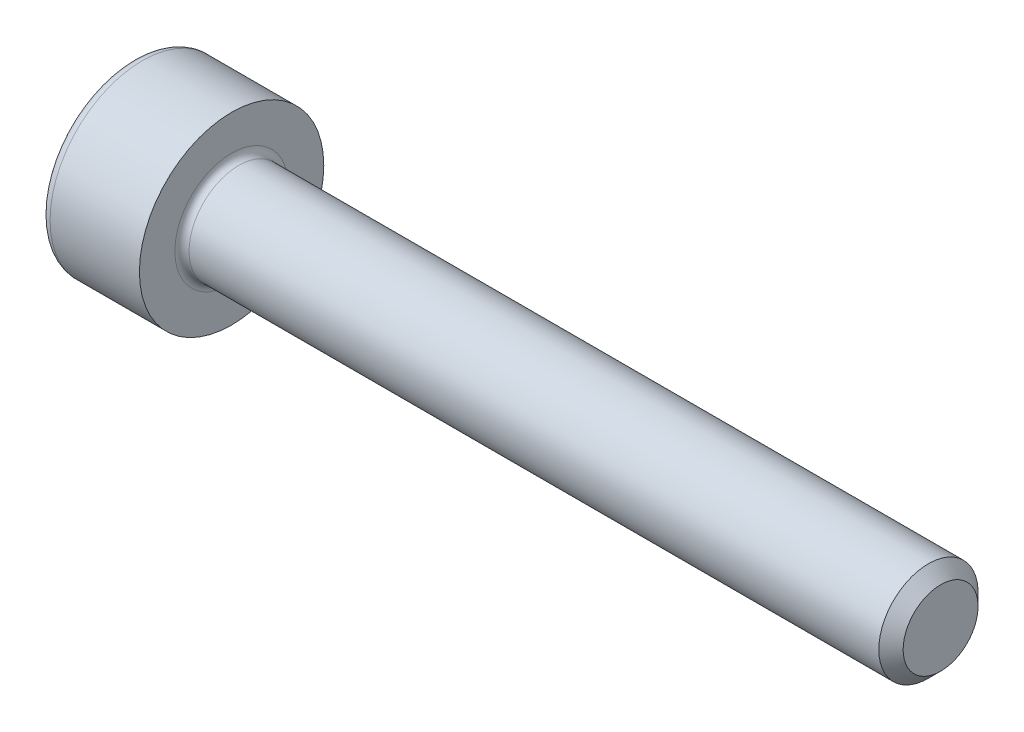
ISO-10303-21;
HEADER;
FILE_DESCRIPTION(('STEP AP214'),'2;1');
FILE_NAME('part.step','',(''),(''),'','','');
FILE_SCHEMA(('AUTOMOTIVE_DESIGN { 1 0 10303 214 1 1 1 1 }'));
ENDSEC;
DATA;
#1=APPLICATION_CONTEXT('core data for automotive mechanical design processes');
#2=APPLICATION_PROTOCOL_DEFINITION('international standard','automotive_design',2000,#1);
#3=PRODUCT_CONTEXT('',#1,'mechanical');
#4=PRODUCT('Part','Part','',(#3));
#5=PRODUCT_RELATED_PRODUCT_CATEGORY('part','',(#4));
#6=PRODUCT_DEFINITION_FORMATION('','',#4);
#7=PRODUCT_DEFINITION_CONTEXT('part definition',#1,'design');
#8=PRODUCT_DEFINITION('design','',#6,#7);
#9=PRODUCT_DEFINITION_SHAPE('','',#8);
#10=(LENGTH_UNIT() NAMED_UNIT(*) SI_UNIT(.MILLI.,.METRE.));
#11=(NAMED_UNIT(*) PLANE_ANGLE_UNIT() SI_UNIT($,.RADIAN.));
#12=(NAMED_UNIT(*) SI_UNIT($,.STERADIAN.) SOLID_ANGLE_UNIT());
#13=UNCERTAINTY_MEASURE_WITH_UNIT(LENGTH_MEASURE(1.E-05),#10,'distance_accuracy_value','');
#14=(GEOMETRIC_REPRESENTATION_CONTEXT(3) GLOBAL_UNCERTAINTY_ASSIGNED_CONTEXT((#13)) GLOBAL_UNIT_ASSIGNED_CONTEXT((#10,
#11,#12)) REPRESENTATION_CONTEXT('',''));
#15=CARTESIAN_POINT('',(0.,0.,0.));
#16=DIRECTION('',(0.,0.,1.));
#17=DIRECTION('',(1.,0.,0.));
#18=AXIS2_PLACEMENT_3D('',#15,#16,#17);
#19=CARTESIAN_POINT('',(0.,0.,0.));
#20=DIRECTION('',(-1.,0.,0.));
#21=DIRECTION('',(0.,0.,1.));
#22=AXIS2_PLACEMENT_3D('',#19,#20,#21);
#23=PLANE('',#22);
#24=DIRECTION('',(0.,-0.499999999999998,0.86602540378444));
#25=VECTOR('',#24,1.);
#26=CARTESIAN_POINT('',(0.,0.7621023553303,0.));
#27=LINE('',#26,#25);
#28=CARTESIAN_POINT('',(0.,0.7621023553303,0.));
#29=VERTEX_POINT('',#28);
#30=CARTESIAN_POINT('',(0.,0.381051177665149,0.659999999999998));
#31=VERTEX_POINT('',#30);
#32=EDGE_CURVE('E292',#29,#31,#27,.T.);
#33=ORIENTED_EDGE('',*,*,#32,.T.);
#34=DIRECTION('',(0.,1.,0.));
#35=VECTOR('',#34,1.);
#36=CARTESIAN_POINT('',(0.,-0.381051177665157,0.659999999999998));
#37=LINE('',#36,#35);
#38=CARTESIAN_POINT('',(0.,-0.381051177665157,0.659999999999998));
#39=VERTEX_POINT('',#38);
#40=EDGE_CURVE('E136',#39,#31,#37,.T.);
#41=ORIENTED_EDGE('',*,*,#40,.F.);
#42=DIRECTION('',(0.,-0.500000000000001,-0.866025403784438));
#43=VECTOR('',#42,1.);
#44=CARTESIAN_POINT('',(0.,-0.381051177665157,0.659999999999998));
#45=LINE('',#44,#43);
#46=CARTESIAN_POINT('',(0.,-0.76210235533031,0.));
#47=VERTEX_POINT('',#46);
#48=EDGE_CURVE('E297',#39,#47,#45,.T.);
#49=ORIENTED_EDGE('',*,*,#48,.T.);
#50=DIRECTION('',(0.,0.499999999999998,-0.86602540378444));
#51=VECTOR('',#50,1.);
#52=CARTESIAN_POINT('',(0.,-0.76210235533031,0.));
#53=LINE('',#52,#51);
#54=CARTESIAN_POINT('',(0.,-0.381051177665159,-0.660000000000002));
#55=VERTEX_POINT('',#54);
#56=EDGE_CURVE('E301',#47,#55,#53,.T.);
#57=ORIENTED_EDGE('',*,*,#56,.T.);
#58=DIRECTION('',(0.,-1.,0.));
#59=VECTOR('',#58,1.);
#60=CARTESIAN_POINT('',(0.,0.381051177665146,-0.660000000000002));
#61=LINE('',#60,#59);
#62=CARTESIAN_POINT('',(0.,0.381051177665146,-0.660000000000002));
#63=VERTEX_POINT('',#62);
#64=EDGE_CURVE('E305',#63,#55,#61,.T.);
#65=ORIENTED_EDGE('',*,*,#64,.F.);
#66=DIRECTION('',(0.,-0.500000000000001,-0.866025403784438));
#67=VECTOR('',#66,1.);
#68=CARTESIAN_POINT('',(0.,0.7621023553303,0.));
#69=LINE('',#68,#67);
#70=EDGE_CURVE('E131',#29,#63,#69,.T.);
#71=ORIENTED_EDGE('',*,*,#70,.F.);
#72=EDGE_LOOP('',(#33,#41,#49,#57,#65,#71));
#73=FACE_BOUND('',#72,.T.);
#74=CARTESIAN_POINT('',(0.,0.,0.));
#75=DIRECTION('',(-1.,0.,0.));
#76=DIRECTION('',(0.,0.,1.));
#77=AXIS2_PLACEMENT_3D('',#74,#75,#76);
#78=CIRCLE('',#77,1.16);
#79=CARTESIAN_POINT('',(0.,0.,1.16));
#80=VERTEX_POINT('',#79);
#81=EDGE_CURVE('E50',#80,#80,#78,.T.);
#82=ORIENTED_EDGE('',*,*,#81,.T.);
#83=EDGE_LOOP('',(#82));
#84=FACE_BOUND('',#83,.T.);
#85=ADVANCED_FACE('F41',(#73,#84),#23,.T.);
#86=CARTESIAN_POINT('',(-31.75,0.,0.));
#87=DIRECTION('',(-1.,0.,0.));
#88=DIRECTION('',(0.,0.,1.));
#89=AXIS2_PLACEMENT_3D('',#86,#87,#88);
#90=CYLINDRICAL_SURFACE('',#89,1.3);
#91=CARTESIAN_POINT('',(0.140000000000001,0.,0.));
#92=DIRECTION('',(-1.,0.,0.));
#93=DIRECTION('',(0.,0.,1.));
#94=AXIS2_PLACEMENT_3D('',#91,#92,#93);
#95=CIRCLE('',#94,1.3);
#96=CARTESIAN_POINT('',(0.140000000000001,0.,1.3));
#97=VERTEX_POINT('',#96);
#98=EDGE_CURVE('E11',#97,#97,#95,.F.);
#99=ORIENTED_EDGE('',*,*,#98,.T.);
#100=EDGE_LOOP('',(#99));
#101=FACE_BOUND('',#100,.T.);
#102=CARTESIAN_POINT('',(1.4,0.,0.));
#103=DIRECTION('',(-1.,0.,0.));
#104=DIRECTION('',(0.,0.,1.));
#105=AXIS2_PLACEMENT_3D('',#102,#103,#104);
#106=CIRCLE('',#105,1.3);
#107=CARTESIAN_POINT('',(1.4,0.,1.3));
#108=VERTEX_POINT('',#107);
#109=EDGE_CURVE('E160',#108,#108,#106,.T.);
#110=ORIENTED_EDGE('',*,*,#109,.T.);
#111=EDGE_LOOP('',(#110));
#112=FACE_BOUND('',#111,.T.);
#113=ADVANCED_FACE('F188',(#101,#112),#90,.T.);
#114=CARTESIAN_POINT('',(1.4,1.3,0.));
#115=DIRECTION('',(1.,0.,0.));
#116=DIRECTION('',(0.,0.,-1.));
#117=AXIS2_PLACEMENT_3D('',#114,#115,#116);
#118=PLANE('',#117);
#119=CARTESIAN_POINT('',(1.4,0.,0.));
#120=DIRECTION('',(1.,0.,0.));
#121=DIRECTION('',(0.,0.,-1.));
#122=AXIS2_PLACEMENT_3D('',#119,#120,#121);
#123=CIRCLE('',#122,0.8);
#124=CARTESIAN_POINT('',(1.4,0.,-0.8));
#125=VERTEX_POINT('',#124);
#126=EDGE_CURVE('E164',#125,#125,#123,.F.);
#127=ORIENTED_EDGE('',*,*,#126,.T.);
#128=EDGE_LOOP('',(#127));
#129=FACE_BOUND('',#128,.T.);
#130=ORIENTED_EDGE('',*,*,#109,.F.);
#131=EDGE_LOOP('',(#130));
#132=FACE_BOUND('',#131,.T.);
#133=ADVANCED_FACE('F194',(#129,#132),#118,.T.);
#134=CARTESIAN_POINT('',(-31.75,0.,0.));
#135=DIRECTION('',(-1.,0.,0.));
#136=DIRECTION('',(0.,0.,1.));
#137=AXIS2_PLACEMENT_3D('',#134,#135,#136);
#138=CYLINDRICAL_SURFACE('',#137,0.7);
#139=CARTESIAN_POINT('',(1.5,0.,0.));
#140=DIRECTION('',(1.,0.,0.));
#141=DIRECTION('',(0.,0.,-1.));
#142=AXIS2_PLACEMENT_3D('',#139,#140,#141);
#143=CIRCLE('',#142,0.7);
#144=CARTESIAN_POINT('',(1.5,0.,-0.7));
#145=VERTEX_POINT('',#144);
#146=EDGE_CURVE('E168',#145,#145,#143,.T.);
#147=ORIENTED_EDGE('',*,*,#146,.T.);
#148=EDGE_LOOP('',(#147));
#149=FACE_BOUND('',#148,.T.);
#150=CARTESIAN_POINT('',(11.2285,0.,0.));
#151=DIRECTION('',(-1.,0.,0.));
#152=DIRECTION('',(0.,0.,1.));
#153=AXIS2_PLACEMENT_3D('',#150,#151,#152);
#154=CIRCLE('',#153,0.700000000000001);
#155=CARTESIAN_POINT('',(11.2285,0.,0.700000000000001));
#156=VERTEX_POINT('',#155);
#157=EDGE_CURVE('E156',#156,#156,#154,.T.);
#158=ORIENTED_EDGE('',*,*,#157,.T.);
#159=EDGE_LOOP('',(#158));
#160=FACE_BOUND('',#159,.T.);
#161=ADVANCED_FACE('F200',(#149,#160),#138,.T.);
#162=CARTESIAN_POINT('',(11.4,0.,0.));
#163=DIRECTION('',(-1.,0.,0.));
#164=DIRECTION('',(0.,0.,1.));
#165=AXIS2_PLACEMENT_3D('',#162,#163,#164);
#166=CONICAL_SURFACE('',#165,0.5285,0.785398163397456);
#167=ORIENTED_EDGE('',*,*,#157,.F.);
#168=EDGE_LOOP('',(#167));
#169=FACE_BOUND('',#168,.T.);
#170=CARTESIAN_POINT('',(11.4,0.,0.));
#171=DIRECTION('',(-1.,0.,0.));
#172=DIRECTION('',(0.,0.,1.));
#173=AXIS2_PLACEMENT_3D('',#170,#171,#172);
#174=CIRCLE('',#173,0.5285);
#175=CARTESIAN_POINT('',(11.4,0.,0.5285));
#176=VERTEX_POINT('',#175);
#177=EDGE_CURVE('E151',#176,#176,#174,.T.);
#178=ORIENTED_EDGE('',*,*,#177,.T.);
#179=EDGE_LOOP('',(#178));
#180=FACE_BOUND('',#179,.T.);
#181=ADVANCED_FACE('F204',(#169,#180),#166,.T.);
#182=CARTESIAN_POINT('',(11.4,0.5285,0.));
#183=DIRECTION('',(1.,0.,0.));
#184=DIRECTION('',(0.,0.,-1.));
#185=AXIS2_PLACEMENT_3D('',#182,#183,#184);
#186=PLANE('',#185);
#187=ORIENTED_EDGE('',*,*,#177,.F.);
#188=EDGE_LOOP('',(#187));
#189=FACE_BOUND('',#188,.T.);
#190=ADVANCED_FACE('F184',(#189),#186,.T.);
#191=CARTESIAN_POINT('',(1.5,0.,0.));
#192=DIRECTION('',(1.,0.,0.));
#193=DIRECTION('',(0.,0.,-1.));
#194=AXIS2_PLACEMENT_3D('',#191,#192,#193);
#195=TOROIDAL_SURFACE('',#194,0.8,0.1);
#196=ORIENTED_EDGE('',*,*,#146,.F.);
#197=EDGE_LOOP('',(#196));
#198=FACE_BOUND('',#197,.T.);
#199=ORIENTED_EDGE('',*,*,#126,.F.);
#200=EDGE_LOOP('',(#199));
#201=FACE_BOUND('',#200,.T.);
#202=ADVANCED_FACE('F177',(#198,#201),#195,.F.);
#203=CARTESIAN_POINT('',(0.140000000000001,0.,0.));
#204=DIRECTION('',(-1.,0.,0.));
#205=DIRECTION('',(0.,0.,1.));
#206=AXIS2_PLACEMENT_3D('',#203,#204,#205);
#207=TOROIDAL_SURFACE('',#206,1.16,0.14);
#208=ORIENTED_EDGE('',*,*,#98,.F.);
#209=EDGE_LOOP('',(#208));
#210=FACE_BOUND('',#209,.T.);
#211=ORIENTED_EDGE('',*,*,#81,.F.);
#212=EDGE_LOOP('',(#211));
#213=FACE_BOUND('',#212,.T.);
#214=ADVANCED_FACE('F43',(#210,#213),#207,.T.);
#215=CARTESIAN_POINT('',(0.6,0.7621023553303,0.));
#216=DIRECTION('',(0.,-0.86602540378444,-0.499999999999998));
#217=DIRECTION('',(0.,0.499999999999998,-0.86602540378444));
#218=AXIS2_PLACEMENT_3D('',#215,#216,#217);
#219=PLANE('',#218);
#220=ORIENTED_EDGE('',*,*,#32,.F.);
#221=DIRECTION('',(-1.,0.,0.));
#222=VECTOR('',#221,1.);
#223=CARTESIAN_POINT('',(0.6,0.7621023553303,0.));
#224=LINE('',#223,#222);
#225=CARTESIAN_POINT('',(0.6,0.7621023553303,0.));
#226=VERTEX_POINT('',#225);
#227=EDGE_CURVE('E291',#226,#29,#224,.T.);
#228=ORIENTED_EDGE('',*,*,#227,.F.);
#229=DIRECTION('',(0.,-0.499999999999998,0.86602540378444));
#230=VECTOR('',#229,1.);
#231=CARTESIAN_POINT('',(0.6,0.7621023553303,0.));
#232=LINE('',#231,#230);
#233=CARTESIAN_POINT('',(0.6,0.57157676649773,0.329999999999998));
#234=VERTEX_POINT('',#233);
#235=EDGE_CURVE('E57',#226,#234,#232,.T.);
#236=ORIENTED_EDGE('',*,*,#235,.T.);
#237=CARTESIAN_POINT('',(0.6,0.381051177665149,0.659999999999998));
#238=VERTEX_POINT('',#237);
#239=EDGE_CURVE('E115',#234,#238,#232,.T.);
#240=ORIENTED_EDGE('',*,*,#239,.T.);
#241=DIRECTION('',(-1.,0.,0.));
#242=VECTOR('',#241,1.);
#243=CARTESIAN_POINT('',(0.6,0.381051177665149,0.659999999999998));
#244=LINE('',#243,#242);
#245=EDGE_CURVE('E128',#238,#31,#244,.T.);
#246=ORIENTED_EDGE('',*,*,#245,.T.);
#247=EDGE_LOOP('',(#220,#228,#236,#240,#246));
#248=FACE_BOUND('',#247,.T.);
#249=ADVANCED_FACE('F127',(#248),#219,.T.);
#250=CARTESIAN_POINT('',(0.6,-0.381051177665157,0.659999999999998));
#251=DIRECTION('',(0.,0.,1.));
#252=DIRECTION('',(0.,-1.,0.));
#253=AXIS2_PLACEMENT_3D('',#250,#251,#252);
#254=PLANE('',#253);
#255=ORIENTED_EDGE('',*,*,#40,.T.);
#256=ORIENTED_EDGE('',*,*,#245,.F.);
#257=DIRECTION('',(0.,1.,0.));
#258=VECTOR('',#257,1.);
#259=CARTESIAN_POINT('',(0.6,-0.381051177665157,0.659999999999998));
#260=LINE('',#259,#258);
#261=CARTESIAN_POINT('',(0.6,0.,0.659999999999998));
#262=VERTEX_POINT('',#261);
#263=EDGE_CURVE('E113',#262,#238,#260,.T.);
#264=ORIENTED_EDGE('',*,*,#263,.F.);
#265=CARTESIAN_POINT('',(0.6,-0.381051177665157,0.659999999999998));
#266=VERTEX_POINT('',#265);
#267=EDGE_CURVE('E124',#266,#262,#260,.T.);
#268=ORIENTED_EDGE('',*,*,#267,.F.);
#269=DIRECTION('',(-1.,0.,0.));
#270=VECTOR('',#269,1.);
#271=CARTESIAN_POINT('',(0.6,-0.381051177665157,0.659999999999998));
#272=LINE('',#271,#270);
#273=EDGE_CURVE('E139',#266,#39,#272,.T.);
#274=ORIENTED_EDGE('',*,*,#273,.T.);
#275=EDGE_LOOP('',(#255,#256,#264,#268,#274));
#276=FACE_BOUND('',#275,.T.);
#277=ADVANCED_FACE('F133',(#276),#254,.F.);
#278=CARTESIAN_POINT('',(0.6,-0.381051177665157,0.659999999999998));
#279=DIRECTION('',(0.,0.866025403784438,-0.500000000000001));
#280=DIRECTION('',(0.,0.500000000000001,0.866025403784438));
#281=AXIS2_PLACEMENT_3D('',#278,#279,#280);
#282=PLANE('',#281);
#283=ORIENTED_EDGE('',*,*,#48,.F.);
#284=ORIENTED_EDGE('',*,*,#273,.F.);
#285=DIRECTION('',(0.,-0.500000000000001,-0.866025403784438));
#286=VECTOR('',#285,1.);
#287=CARTESIAN_POINT('',(0.6,-0.381051177665157,0.659999999999998));
#288=LINE('',#287,#286);
#289=CARTESIAN_POINT('',(0.6,-0.571576766497731,0.330000000000002));
#290=VERTEX_POINT('',#289);
#291=EDGE_CURVE('E266',#266,#290,#288,.T.);
#292=ORIENTED_EDGE('',*,*,#291,.T.);
#293=CARTESIAN_POINT('',(0.6,-0.76210235533031,0.));
#294=VERTEX_POINT('',#293);
#295=EDGE_CURVE('E268',#290,#294,#288,.T.);
#296=ORIENTED_EDGE('',*,*,#295,.T.);
#297=DIRECTION('',(-1.,0.,0.));
#298=VECTOR('',#297,1.);
#299=CARTESIAN_POINT('',(0.6,-0.76210235533031,0.));
#300=LINE('',#299,#298);
#301=EDGE_CURVE('E146',#294,#47,#300,.T.);
#302=ORIENTED_EDGE('',*,*,#301,.T.);
#303=EDGE_LOOP('',(#283,#284,#292,#296,#302));
#304=FACE_BOUND('',#303,.T.);
#305=ADVANCED_FACE('F217',(#304),#282,.T.);
#306=CARTESIAN_POINT('',(0.6,-0.76210235533031,0.));
#307=DIRECTION('',(0.,0.86602540378444,0.499999999999998));
#308=DIRECTION('',(0.,-0.499999999999998,0.86602540378444));
#309=AXIS2_PLACEMENT_3D('',#306,#307,#308);
#310=PLANE('',#309);
#311=ORIENTED_EDGE('',*,*,#56,.F.);
#312=ORIENTED_EDGE('',*,*,#301,.F.);
#313=DIRECTION('',(0.,0.499999999999998,-0.86602540378444));
#314=VECTOR('',#313,1.);
#315=CARTESIAN_POINT('',(0.6,-0.76210235533031,0.));
#316=LINE('',#315,#314);
#317=CARTESIAN_POINT('',(0.6,-0.571576766497735,-0.330000000000001));
#318=VERTEX_POINT('',#317);
#319=EDGE_CURVE('E271',#294,#318,#316,.T.);
#320=ORIENTED_EDGE('',*,*,#319,.T.);
#321=CARTESIAN_POINT('',(0.6,-0.381051177665159,-0.660000000000002));
#322=VERTEX_POINT('',#321);
#323=EDGE_CURVE('E277',#318,#322,#316,.T.);
#324=ORIENTED_EDGE('',*,*,#323,.T.);
#325=DIRECTION('',(-1.,0.,0.));
#326=VECTOR('',#325,1.);
#327=CARTESIAN_POINT('',(0.6,-0.381051177665159,-0.660000000000002));
#328=LINE('',#327,#326);
#329=EDGE_CURVE('E318',#322,#55,#328,.T.);
#330=ORIENTED_EDGE('',*,*,#329,.T.);
#331=EDGE_LOOP('',(#311,#312,#320,#324,#330));
#332=FACE_BOUND('',#331,.T.);
#333=ADVANCED_FACE('F220',(#332),#310,.T.);
#334=CARTESIAN_POINT('',(0.6,0.381051177665146,-0.660000000000002));
#335=DIRECTION('',(0.,0.,-1.));
#336=DIRECTION('',(0.,1.,0.));
#337=AXIS2_PLACEMENT_3D('',#334,#335,#336);
#338=PLANE('',#337);
#339=ORIENTED_EDGE('',*,*,#64,.T.);
#340=ORIENTED_EDGE('',*,*,#329,.F.);
#341=DIRECTION('',(0.,-1.,0.));
#342=VECTOR('',#341,1.);
#343=CARTESIAN_POINT('',(0.6,0.381051177665146,-0.660000000000002));
#344=LINE('',#343,#342);
#345=CARTESIAN_POINT('',(0.6,0.,-0.660000000000002));
#346=VERTEX_POINT('',#345);
#347=EDGE_CURVE('E283',#346,#322,#344,.T.);
#348=ORIENTED_EDGE('',*,*,#347,.F.);
#349=CARTESIAN_POINT('',(0.6,0.381051177665146,-0.660000000000002));
#350=VERTEX_POINT('',#349);
#351=EDGE_CURVE('E284',#350,#346,#344,.T.);
#352=ORIENTED_EDGE('',*,*,#351,.F.);
#353=DIRECTION('',(-1.,0.,0.));
#354=VECTOR('',#353,1.);
#355=CARTESIAN_POINT('',(0.6,0.381051177665146,-0.660000000000002));
#356=LINE('',#355,#354);
#357=EDGE_CURVE('E314',#350,#63,#356,.T.);
#358=ORIENTED_EDGE('',*,*,#357,.T.);
#359=EDGE_LOOP('',(#339,#340,#348,#352,#358));
#360=FACE_BOUND('',#359,.T.);
#361=ADVANCED_FACE('F224',(#360),#338,.F.);
#362=CARTESIAN_POINT('',(0.6,0.7621023553303,0.));
#363=DIRECTION('',(0.,0.866025403784438,-0.500000000000001));
#364=DIRECTION('',(0.,0.500000000000001,0.866025403784438));
#365=AXIS2_PLACEMENT_3D('',#362,#363,#364);
#366=PLANE('',#365);
#367=ORIENTED_EDGE('',*,*,#70,.T.);
#368=ORIENTED_EDGE('',*,*,#357,.F.);
#369=DIRECTION('',(0.,-0.500000000000001,-0.866025403784438));
#370=VECTOR('',#369,1.);
#371=CARTESIAN_POINT('',(0.6,0.7621023553303,0.));
#372=LINE('',#371,#370);
#373=CARTESIAN_POINT('',(0.6,0.571576766497725,-0.329999999999998));
#374=VERTEX_POINT('',#373);
#375=EDGE_CURVE('E288',#374,#350,#372,.T.);
#376=ORIENTED_EDGE('',*,*,#375,.F.);
#377=EDGE_CURVE('E256',#226,#374,#372,.T.);
#378=ORIENTED_EDGE('',*,*,#377,.F.);
#379=ORIENTED_EDGE('',*,*,#227,.T.);
#380=EDGE_LOOP('',(#367,#368,#376,#378,#379));
#381=FACE_BOUND('',#380,.T.);
#382=ADVANCED_FACE('F228',(#381),#366,.F.);
#383=CARTESIAN_POINT('',(0.6,0.381051177665149,0.659999999999998));
#384=DIRECTION('',(-1.,0.,0.));
#385=DIRECTION('',(0.,0.,1.));
#386=AXIS2_PLACEMENT_3D('',#383,#384,#385);
#387=PLANE('',#386);
#388=CARTESIAN_POINT('',(0.6,0.,0.));
#389=DIRECTION('',(-1.,0.,0.));
#390=DIRECTION('',(0.,0.,1.));
#391=AXIS2_PLACEMENT_3D('',#388,#389,#390);
#392=CIRCLE('',#391,0.659999999999999);
#393=EDGE_CURVE('E138',#290,#262,#392,.T.);
#394=ORIENTED_EDGE('',*,*,#393,.F.);
#395=ORIENTED_EDGE('',*,*,#291,.F.);
#396=ORIENTED_EDGE('',*,*,#267,.T.);
#397=EDGE_LOOP('',(#394,#395,#396));
#398=FACE_BOUND('',#397,.T.);
#399=ADVANCED_FACE('F232',(#398),#387,.T.);
#400=EDGE_CURVE('E144',#318,#290,#392,.T.);
#401=ORIENTED_EDGE('',*,*,#400,.F.);
#402=ORIENTED_EDGE('',*,*,#319,.F.);
#403=ORIENTED_EDGE('',*,*,#295,.F.);
#404=EDGE_LOOP('',(#401,#402,#403));
#405=FACE_BOUND('',#404,.T.);
#406=ADVANCED_FACE('F235',(#405),#387,.T.);
#407=EDGE_CURVE('E330',#346,#318,#392,.T.);
#408=ORIENTED_EDGE('',*,*,#407,.F.);
#409=ORIENTED_EDGE('',*,*,#347,.T.);
#410=ORIENTED_EDGE('',*,*,#323,.F.);
#411=EDGE_LOOP('',(#408,#409,#410));
#412=FACE_BOUND('',#411,.T.);
#413=ADVANCED_FACE('F240',(#412),#387,.T.);
#414=EDGE_CURVE('E260',#374,#346,#392,.T.);
#415=ORIENTED_EDGE('',*,*,#414,.F.);
#416=ORIENTED_EDGE('',*,*,#375,.T.);
#417=ORIENTED_EDGE('',*,*,#351,.T.);
#418=EDGE_LOOP('',(#415,#416,#417));
#419=FACE_BOUND('',#418,.T.);
#420=ADVANCED_FACE('F247',(#419),#387,.T.);
#421=EDGE_CURVE('E152',#234,#374,#392,.T.);
#422=ORIENTED_EDGE('',*,*,#421,.F.);
#423=ORIENTED_EDGE('',*,*,#235,.F.);
#424=ORIENTED_EDGE('',*,*,#377,.T.);
#425=EDGE_LOOP('',(#422,#423,#424));
#426=FACE_BOUND('',#425,.T.);
#427=ADVANCED_FACE('F243',(#426),#387,.T.);
#428=EDGE_CURVE('E118',#262,#234,#392,.T.);
#429=ORIENTED_EDGE('',*,*,#428,.F.);
#430=ORIENTED_EDGE('',*,*,#263,.T.);
#431=ORIENTED_EDGE('',*,*,#239,.F.);
#432=EDGE_LOOP('',(#429,#430,#431));
#433=FACE_BOUND('',#432,.T.);
#434=ADVANCED_FACE('F114',(#433),#387,.T.);
#435=CARTESIAN_POINT('',(0.6,0.,0.));
#436=DIRECTION('',(-1.,0.,0.));
#437=DIRECTION('',(0.,0.,1.));
#438=AXIS2_PLACEMENT_3D('',#435,#436,#437);
#439=CONICAL_SURFACE('',#438,0.659999999999999,1.04719755119658);
#440=CARTESIAN_POINT('',(0.981051177665164,0.,0.));
#441=VERTEX_POINT('',#440);
#442=VERTEX_LOOP('',#441);
#443=FACE_BOUND('',#442,.T.);
#444=ORIENTED_EDGE('',*,*,#428,.T.);
#445=ORIENTED_EDGE('',*,*,#421,.T.);
#446=ORIENTED_EDGE('',*,*,#414,.T.);
#447=ORIENTED_EDGE('',*,*,#407,.T.);
#448=ORIENTED_EDGE('',*,*,#400,.T.);
#449=ORIENTED_EDGE('',*,*,#393,.T.);
#450=EDGE_LOOP('',(#444,#445,#446,#447,#448,#449));
#451=FACE_BOUND('',#450,.T.);
#452=ADVANCED_FACE('F212',(#443,#451),#439,.F.);
#453=CLOSED_SHELL('',(#85,#113,#133,#161,#181,#190,#202,#214,#249,#277,#305,#333,#361,#382,#399,
#406,#413,#420,#427,#434,#452));
#454=MANIFOLD_SOLID_BREP('B2',#453);
#455=ADVANCED_BREP_SHAPE_REPRESENTATION('',(#18,#454),#14);
#456=SHAPE_DEFINITION_REPRESENTATION(#9,#455);
ENDSEC;
END-ISO-10303-21;
